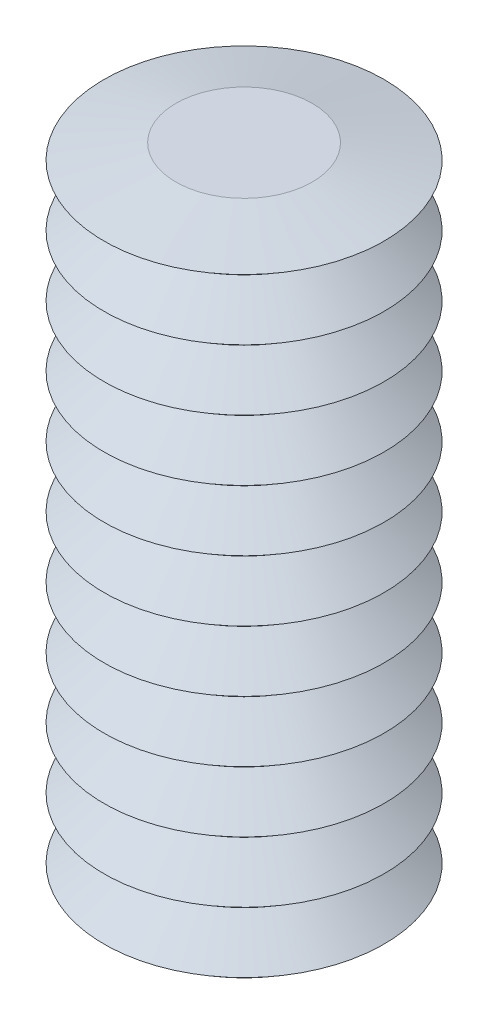
ISO-10303-21;
HEADER;
FILE_DESCRIPTION(('STEP AP214'),'2;1');
FILE_NAME('part.step','',(''),(''),'','','');
FILE_SCHEMA(('AUTOMOTIVE_DESIGN { 1 0 10303 214 1 1 1 1 }'));
ENDSEC;
DATA;
#1=APPLICATION_CONTEXT('core data for automotive mechanical design processes');
#2=APPLICATION_PROTOCOL_DEFINITION('international standard','automotive_design',2000,#1);
#3=PRODUCT_CONTEXT('',#1,'mechanical');
#4=PRODUCT('Part','Part','',(#3));
#5=PRODUCT_RELATED_PRODUCT_CATEGORY('part','',(#4));
#6=PRODUCT_DEFINITION_FORMATION('','',#4);
#7=PRODUCT_DEFINITION_CONTEXT('part definition',#1,'design');
#8=PRODUCT_DEFINITION('design','',#6,#7);
#9=PRODUCT_DEFINITION_SHAPE('','',#8);
#10=(LENGTH_UNIT() NAMED_UNIT(*) SI_UNIT(.MILLI.,.METRE.));
#11=(NAMED_UNIT(*) PLANE_ANGLE_UNIT() SI_UNIT($,.RADIAN.));
#12=(NAMED_UNIT(*) SI_UNIT($,.STERADIAN.) SOLID_ANGLE_UNIT());
#13=UNCERTAINTY_MEASURE_WITH_UNIT(LENGTH_MEASURE(1.E-05),#10,'distance_accuracy_value','');
#14=(GEOMETRIC_REPRESENTATION_CONTEXT(3) GLOBAL_UNCERTAINTY_ASSIGNED_CONTEXT((#13)) GLOBAL_UNIT_ASSIGNED_CONTEXT((#10,
#11,#12)) REPRESENTATION_CONTEXT('',''));
#15=CARTESIAN_POINT('',(0.,0.,0.));
#16=DIRECTION('',(0.,0.,1.));
#17=DIRECTION('',(1.,0.,0.));
#18=AXIS2_PLACEMENT_3D('',#15,#16,#17);
#19=CARTESIAN_POINT('',(0.,0.,0.));
#20=DIRECTION('',(0.,1.,0.));
#21=DIRECTION('',(0.,0.,1.));
#22=AXIS2_PLACEMENT_3D('',#19,#20,#21);
#23=PLANE('',#22);
#24=CARTESIAN_POINT('',(0.,0.,0.));
#25=DIRECTION('',(0.,-1.,0.));
#26=DIRECTION('',(0.,0.,-1.));
#27=AXIS2_PLACEMENT_3D('',#24,#25,#26);
#28=CIRCLE('',#27,2.24);
#29=CARTESIAN_POINT('',(0.,0.,-2.24));
#30=VERTEX_POINT('',#29);
#31=EDGE_CURVE('E10',#30,#30,#28,.T.);
#32=ORIENTED_EDGE('',*,*,#31,.F.);
#33=EDGE_LOOP('',(#32));
#34=FACE_BOUND('',#33,.T.);
#35=ADVANCED_FACE('F31',(#34),#23,.T.);
#36=CARTESIAN_POINT('',(0.,-0.5,0.));
#37=DIRECTION('',(0.,-1.,0.));
#38=DIRECTION('',(0.,0.,-1.));
#39=AXIS2_PLACEMENT_3D('',#36,#37,#38);
#40=CONICAL_SURFACE('',#39,4.6,1.36201914461283);
#41=ORIENTED_EDGE('',*,*,#31,.T.);
#42=EDGE_LOOP('',(#41));
#43=FACE_BOUND('',#42,.T.);
#44=CARTESIAN_POINT('',(0.,-0.5,0.));
#45=DIRECTION('',(0.,-1.,0.));
#46=DIRECTION('',(0.,0.,-1.));
#47=AXIS2_PLACEMENT_3D('',#44,#45,#46);
#48=CIRCLE('',#47,4.6);
#49=CARTESIAN_POINT('',(0.,-0.5,-4.6));
#50=VERTEX_POINT('',#49);
#51=EDGE_CURVE('E37',#50,#50,#48,.T.);
#52=ORIENTED_EDGE('',*,*,#51,.F.);
#53=EDGE_LOOP('',(#52));
#54=FACE_BOUND('',#53,.T.);
#55=ADVANCED_FACE('F127',(#43,#54),#40,.T.);
#56=CARTESIAN_POINT('',(0.,-1.5,0.));
#57=DIRECTION('',(0.,1.,0.));
#58=DIRECTION('',(0.,0.,1.));
#59=AXIS2_PLACEMENT_3D('',#56,#57,#58);
#60=CONICAL_SURFACE('',#59,3.2,0.950546840812075);
#61=ORIENTED_EDGE('',*,*,#51,.T.);
#62=EDGE_LOOP('',(#61));
#63=FACE_BOUND('',#62,.T.);
#64=CARTESIAN_POINT('',(0.,-1.5,0.));
#65=DIRECTION('',(0.,-1.,0.));
#66=DIRECTION('',(0.,0.,-1.));
#67=AXIS2_PLACEMENT_3D('',#64,#65,#66);
#68=CIRCLE('',#67,3.2);
#69=CARTESIAN_POINT('',(0.,-1.5,-3.2));
#70=VERTEX_POINT('',#69);
#71=EDGE_CURVE('E41',#70,#70,#68,.T.);
#72=ORIENTED_EDGE('',*,*,#71,.F.);
#73=EDGE_LOOP('',(#72));
#74=FACE_BOUND('',#73,.T.);
#75=ADVANCED_FACE('F132',(#63,#74),#60,.T.);
#76=CARTESIAN_POINT('',(0.,-2.5,0.));
#77=DIRECTION('',(0.,-1.,0.));
#78=DIRECTION('',(0.,0.,-1.));
#79=AXIS2_PLACEMENT_3D('',#76,#77,#78);
#80=CONICAL_SURFACE('',#79,4.6,0.950546840812076);
#81=ORIENTED_EDGE('',*,*,#71,.T.);
#82=EDGE_LOOP('',(#81));
#83=FACE_BOUND('',#82,.T.);
#84=CARTESIAN_POINT('',(0.,-2.5,0.));
#85=DIRECTION('',(0.,-1.,0.));
#86=DIRECTION('',(0.,0.,-1.));
#87=AXIS2_PLACEMENT_3D('',#84,#85,#86);
#88=CIRCLE('',#87,4.6);
#89=CARTESIAN_POINT('',(0.,-2.5,-4.6));
#90=VERTEX_POINT('',#89);
#91=EDGE_CURVE('E45',#90,#90,#88,.T.);
#92=ORIENTED_EDGE('',*,*,#91,.F.);
#93=EDGE_LOOP('',(#92));
#94=FACE_BOUND('',#93,.T.);
#95=ADVANCED_FACE('F136',(#83,#94),#80,.T.);
#96=CARTESIAN_POINT('',(0.,-3.5,0.));
#97=DIRECTION('',(0.,1.,0.));
#98=DIRECTION('',(0.,0.,1.));
#99=AXIS2_PLACEMENT_3D('',#96,#97,#98);
#100=CONICAL_SURFACE('',#99,3.2,0.950546840812075);
#101=ORIENTED_EDGE('',*,*,#91,.T.);
#102=EDGE_LOOP('',(#101));
#103=FACE_BOUND('',#102,.T.);
#104=CARTESIAN_POINT('',(0.,-3.5,0.));
#105=DIRECTION('',(0.,-1.,0.));
#106=DIRECTION('',(0.,0.,-1.));
#107=AXIS2_PLACEMENT_3D('',#104,#105,#106);
#108=CIRCLE('',#107,3.2);
#109=CARTESIAN_POINT('',(0.,-3.5,-3.2));
#110=VERTEX_POINT('',#109);
#111=EDGE_CURVE('E50',#110,#110,#108,.T.);
#112=ORIENTED_EDGE('',*,*,#111,.F.);
#113=EDGE_LOOP('',(#112));
#114=FACE_BOUND('',#113,.T.);
#115=ADVANCED_FACE('F142',(#103,#114),#100,.T.);
#116=CARTESIAN_POINT('',(0.,-4.5,0.));
#117=DIRECTION('',(0.,-1.,0.));
#118=DIRECTION('',(0.,0.,-1.));
#119=AXIS2_PLACEMENT_3D('',#116,#117,#118);
#120=CONICAL_SURFACE('',#119,4.6,0.950546840812075);
#121=ORIENTED_EDGE('',*,*,#111,.T.);
#122=EDGE_LOOP('',(#121));
#123=FACE_BOUND('',#122,.T.);
#124=CARTESIAN_POINT('',(0.,-4.5,0.));
#125=DIRECTION('',(0.,-1.,0.));
#126=DIRECTION('',(0.,0.,-1.));
#127=AXIS2_PLACEMENT_3D('',#124,#125,#126);
#128=CIRCLE('',#127,4.6);
#129=CARTESIAN_POINT('',(0.,-4.5,-4.6));
#130=VERTEX_POINT('',#129);
#131=EDGE_CURVE('E53',#130,#130,#128,.T.);
#132=ORIENTED_EDGE('',*,*,#131,.F.);
#133=EDGE_LOOP('',(#132));
#134=FACE_BOUND('',#133,.T.);
#135=ADVANCED_FACE('F146',(#123,#134),#120,.T.);
#136=CARTESIAN_POINT('',(0.,-5.5,0.));
#137=DIRECTION('',(0.,1.,0.));
#138=DIRECTION('',(0.,0.,1.));
#139=AXIS2_PLACEMENT_3D('',#136,#137,#138);
#140=CONICAL_SURFACE('',#139,3.2,0.950546840812076);
#141=ORIENTED_EDGE('',*,*,#131,.T.);
#142=EDGE_LOOP('',(#141));
#143=FACE_BOUND('',#142,.T.);
#144=CARTESIAN_POINT('',(0.,-5.5,0.));
#145=DIRECTION('',(0.,-1.,0.));
#146=DIRECTION('',(0.,0.,-1.));
#147=AXIS2_PLACEMENT_3D('',#144,#145,#146);
#148=CIRCLE('',#147,3.2);
#149=CARTESIAN_POINT('',(0.,-5.5,-3.2));
#150=VERTEX_POINT('',#149);
#151=EDGE_CURVE('E56',#150,#150,#148,.T.);
#152=ORIENTED_EDGE('',*,*,#151,.F.);
#153=EDGE_LOOP('',(#152));
#154=FACE_BOUND('',#153,.T.);
#155=ADVANCED_FACE('F150',(#143,#154),#140,.T.);
#156=CARTESIAN_POINT('',(0.,-6.5,0.));
#157=DIRECTION('',(0.,-1.,0.));
#158=DIRECTION('',(0.,0.,-1.));
#159=AXIS2_PLACEMENT_3D('',#156,#157,#158);
#160=CONICAL_SURFACE('',#159,4.6,0.950546840812075);
#161=ORIENTED_EDGE('',*,*,#151,.T.);
#162=EDGE_LOOP('',(#161));
#163=FACE_BOUND('',#162,.T.);
#164=CARTESIAN_POINT('',(0.,-6.5,0.));
#165=DIRECTION('',(0.,-1.,0.));
#166=DIRECTION('',(0.,0.,-1.));
#167=AXIS2_PLACEMENT_3D('',#164,#165,#166);
#168=CIRCLE('',#167,4.6);
#169=CARTESIAN_POINT('',(0.,-6.5,-4.6));
#170=VERTEX_POINT('',#169);
#171=EDGE_CURVE('E59',#170,#170,#168,.T.);
#172=ORIENTED_EDGE('',*,*,#171,.F.);
#173=EDGE_LOOP('',(#172));
#174=FACE_BOUND('',#173,.T.);
#175=ADVANCED_FACE('F154',(#163,#174),#160,.T.);
#176=CARTESIAN_POINT('',(0.,-7.5,0.));
#177=DIRECTION('',(0.,1.,0.));
#178=DIRECTION('',(0.,0.,1.));
#179=AXIS2_PLACEMENT_3D('',#176,#177,#178);
#180=CONICAL_SURFACE('',#179,3.2,0.950546840812075);
#181=ORIENTED_EDGE('',*,*,#171,.T.);
#182=EDGE_LOOP('',(#181));
#183=FACE_BOUND('',#182,.T.);
#184=CARTESIAN_POINT('',(0.,-7.5,0.));
#185=DIRECTION('',(0.,-1.,0.));
#186=DIRECTION('',(0.,0.,-1.));
#187=AXIS2_PLACEMENT_3D('',#184,#185,#186);
#188=CIRCLE('',#187,3.2);
#189=CARTESIAN_POINT('',(0.,-7.5,-3.2));
#190=VERTEX_POINT('',#189);
#191=EDGE_CURVE('E62',#190,#190,#188,.T.);
#192=ORIENTED_EDGE('',*,*,#191,.F.);
#193=EDGE_LOOP('',(#192));
#194=FACE_BOUND('',#193,.T.);
#195=ADVANCED_FACE('F158',(#183,#194),#180,.T.);
#196=CARTESIAN_POINT('',(0.,-8.5,0.));
#197=DIRECTION('',(0.,-1.,0.));
#198=DIRECTION('',(0.,0.,-1.));
#199=AXIS2_PLACEMENT_3D('',#196,#197,#198);
#200=CONICAL_SURFACE('',#199,4.6,0.950546840812075);
#201=ORIENTED_EDGE('',*,*,#191,.T.);
#202=EDGE_LOOP('',(#201));
#203=FACE_BOUND('',#202,.T.);
#204=CARTESIAN_POINT('',(0.,-8.5,0.));
#205=DIRECTION('',(0.,-1.,0.));
#206=DIRECTION('',(0.,0.,-1.));
#207=AXIS2_PLACEMENT_3D('',#204,#205,#206);
#208=CIRCLE('',#207,4.6);
#209=CARTESIAN_POINT('',(0.,-8.5,-4.6));
#210=VERTEX_POINT('',#209);
#211=EDGE_CURVE('E65',#210,#210,#208,.T.);
#212=ORIENTED_EDGE('',*,*,#211,.F.);
#213=EDGE_LOOP('',(#212));
#214=FACE_BOUND('',#213,.T.);
#215=ADVANCED_FACE('F162',(#203,#214),#200,.T.);
#216=CARTESIAN_POINT('',(0.,-9.5,0.));
#217=DIRECTION('',(0.,1.,0.));
#218=DIRECTION('',(0.,0.,1.));
#219=AXIS2_PLACEMENT_3D('',#216,#217,#218);
#220=CONICAL_SURFACE('',#219,3.2,0.950546840812075);
#221=ORIENTED_EDGE('',*,*,#211,.T.);
#222=EDGE_LOOP('',(#221));
#223=FACE_BOUND('',#222,.T.);
#224=CARTESIAN_POINT('',(0.,-9.5,0.));
#225=DIRECTION('',(0.,-1.,0.));
#226=DIRECTION('',(0.,0.,-1.));
#227=AXIS2_PLACEMENT_3D('',#224,#225,#226);
#228=CIRCLE('',#227,3.2);
#229=CARTESIAN_POINT('',(0.,-9.5,-3.2));
#230=VERTEX_POINT('',#229);
#231=EDGE_CURVE('E68',#230,#230,#228,.T.);
#232=ORIENTED_EDGE('',*,*,#231,.F.);
#233=EDGE_LOOP('',(#232));
#234=FACE_BOUND('',#233,.T.);
#235=ADVANCED_FACE('F166',(#223,#234),#220,.T.);
#236=CARTESIAN_POINT('',(0.,-10.5,0.));
#237=DIRECTION('',(0.,-1.,0.));
#238=DIRECTION('',(0.,0.,-1.));
#239=AXIS2_PLACEMENT_3D('',#236,#237,#238);
#240=CONICAL_SURFACE('',#239,4.6,0.950546840812076);
#241=ORIENTED_EDGE('',*,*,#231,.T.);
#242=EDGE_LOOP('',(#241));
#243=FACE_BOUND('',#242,.T.);
#244=CARTESIAN_POINT('',(0.,-10.5,0.));
#245=DIRECTION('',(0.,-1.,0.));
#246=DIRECTION('',(0.,0.,-1.));
#247=AXIS2_PLACEMENT_3D('',#244,#245,#246);
#248=CIRCLE('',#247,4.6);
#249=CARTESIAN_POINT('',(0.,-10.5,-4.6));
#250=VERTEX_POINT('',#249);
#251=EDGE_CURVE('E71',#250,#250,#248,.T.);
#252=ORIENTED_EDGE('',*,*,#251,.F.);
#253=EDGE_LOOP('',(#252));
#254=FACE_BOUND('',#253,.T.);
#255=ADVANCED_FACE('F170',(#243,#254),#240,.T.);
#256=CARTESIAN_POINT('',(0.,-11.5,0.));
#257=DIRECTION('',(0.,1.,0.));
#258=DIRECTION('',(0.,0.,1.));
#259=AXIS2_PLACEMENT_3D('',#256,#257,#258);
#260=CONICAL_SURFACE('',#259,3.2,0.950546840812076);
#261=ORIENTED_EDGE('',*,*,#251,.T.);
#262=EDGE_LOOP('',(#261));
#263=FACE_BOUND('',#262,.T.);
#264=CARTESIAN_POINT('',(0.,-11.5,0.));
#265=DIRECTION('',(0.,-1.,0.));
#266=DIRECTION('',(0.,0.,-1.));
#267=AXIS2_PLACEMENT_3D('',#264,#265,#266);
#268=CIRCLE('',#267,3.2);
#269=CARTESIAN_POINT('',(0.,-11.5,-3.2));
#270=VERTEX_POINT('',#269);
#271=EDGE_CURVE('E74',#270,#270,#268,.T.);
#272=ORIENTED_EDGE('',*,*,#271,.F.);
#273=EDGE_LOOP('',(#272));
#274=FACE_BOUND('',#273,.T.);
#275=ADVANCED_FACE('F174',(#263,#274),#260,.T.);
#276=CARTESIAN_POINT('',(0.,-12.5,0.));
#277=DIRECTION('',(0.,-1.,0.));
#278=DIRECTION('',(0.,0.,-1.));
#279=AXIS2_PLACEMENT_3D('',#276,#277,#278);
#280=CONICAL_SURFACE('',#279,4.6,0.950546840812075);
#281=ORIENTED_EDGE('',*,*,#271,.T.);
#282=EDGE_LOOP('',(#281));
#283=FACE_BOUND('',#282,.T.);
#284=CARTESIAN_POINT('',(0.,-12.5,0.));
#285=DIRECTION('',(0.,-1.,0.));
#286=DIRECTION('',(0.,0.,-1.));
#287=AXIS2_PLACEMENT_3D('',#284,#285,#286);
#288=CIRCLE('',#287,4.6);
#289=CARTESIAN_POINT('',(0.,-12.5,-4.6));
#290=VERTEX_POINT('',#289);
#291=EDGE_CURVE('E77',#290,#290,#288,.T.);
#292=ORIENTED_EDGE('',*,*,#291,.F.);
#293=EDGE_LOOP('',(#292));
#294=FACE_BOUND('',#293,.T.);
#295=ADVANCED_FACE('F178',(#283,#294),#280,.T.);
#296=CARTESIAN_POINT('',(0.,-13.5,0.));
#297=DIRECTION('',(0.,1.,0.));
#298=DIRECTION('',(0.,0.,1.));
#299=AXIS2_PLACEMENT_3D('',#296,#297,#298);
#300=CONICAL_SURFACE('',#299,3.2,0.950546840812076);
#301=ORIENTED_EDGE('',*,*,#291,.T.);
#302=EDGE_LOOP('',(#301));
#303=FACE_BOUND('',#302,.T.);
#304=CARTESIAN_POINT('',(0.,-13.5,0.));
#305=DIRECTION('',(0.,-1.,0.));
#306=DIRECTION('',(0.,0.,-1.));
#307=AXIS2_PLACEMENT_3D('',#304,#305,#306);
#308=CIRCLE('',#307,3.2);
#309=CARTESIAN_POINT('',(0.,-13.5,-3.2));
#310=VERTEX_POINT('',#309);
#311=EDGE_CURVE('E80',#310,#310,#308,.T.);
#312=ORIENTED_EDGE('',*,*,#311,.F.);
#313=EDGE_LOOP('',(#312));
#314=FACE_BOUND('',#313,.T.);
#315=ADVANCED_FACE('F182',(#303,#314),#300,.T.);
#316=CARTESIAN_POINT('',(0.,-14.5,0.));
#317=DIRECTION('',(0.,-1.,0.));
#318=DIRECTION('',(0.,0.,-1.));
#319=AXIS2_PLACEMENT_3D('',#316,#317,#318);
#320=CONICAL_SURFACE('',#319,4.6,0.950546840812075);
#321=ORIENTED_EDGE('',*,*,#311,.T.);
#322=EDGE_LOOP('',(#321));
#323=FACE_BOUND('',#322,.T.);
#324=CARTESIAN_POINT('',(0.,-14.5,0.));
#325=DIRECTION('',(0.,-1.,0.));
#326=DIRECTION('',(0.,0.,-1.));
#327=AXIS2_PLACEMENT_3D('',#324,#325,#326);
#328=CIRCLE('',#327,4.6);
#329=CARTESIAN_POINT('',(0.,-14.5,-4.6));
#330=VERTEX_POINT('',#329);
#331=EDGE_CURVE('E83',#330,#330,#328,.T.);
#332=ORIENTED_EDGE('',*,*,#331,.F.);
#333=EDGE_LOOP('',(#332));
#334=FACE_BOUND('',#333,.T.);
#335=ADVANCED_FACE('F186',(#323,#334),#320,.T.);
#336=CARTESIAN_POINT('',(0.,-15.5,0.));
#337=DIRECTION('',(0.,1.,0.));
#338=DIRECTION('',(0.,0.,1.));
#339=AXIS2_PLACEMENT_3D('',#336,#337,#338);
#340=CONICAL_SURFACE('',#339,3.2,0.950546840812076);
#341=ORIENTED_EDGE('',*,*,#331,.T.);
#342=EDGE_LOOP('',(#341));
#343=FACE_BOUND('',#342,.T.);
#344=CARTESIAN_POINT('',(0.,-15.5,0.));
#345=DIRECTION('',(0.,-1.,0.));
#346=DIRECTION('',(0.,0.,-1.));
#347=AXIS2_PLACEMENT_3D('',#344,#345,#346);
#348=CIRCLE('',#347,3.2);
#349=CARTESIAN_POINT('',(0.,-15.5,-3.2));
#350=VERTEX_POINT('',#349);
#351=EDGE_CURVE('E86',#350,#350,#348,.T.);
#352=ORIENTED_EDGE('',*,*,#351,.F.);
#353=EDGE_LOOP('',(#352));
#354=FACE_BOUND('',#353,.T.);
#355=ADVANCED_FACE('F190',(#343,#354),#340,.T.);
#356=CARTESIAN_POINT('',(0.,-16.5,0.));
#357=DIRECTION('',(0.,-1.,0.));
#358=DIRECTION('',(0.,0.,-1.));
#359=AXIS2_PLACEMENT_3D('',#356,#357,#358);
#360=CONICAL_SURFACE('',#359,4.6,0.950546840812075);
#361=ORIENTED_EDGE('',*,*,#351,.T.);
#362=EDGE_LOOP('',(#361));
#363=FACE_BOUND('',#362,.T.);
#364=CARTESIAN_POINT('',(0.,-16.5,0.));
#365=DIRECTION('',(0.,-1.,0.));
#366=DIRECTION('',(0.,0.,-1.));
#367=AXIS2_PLACEMENT_3D('',#364,#365,#366);
#368=CIRCLE('',#367,4.6);
#369=CARTESIAN_POINT('',(0.,-16.5,-4.6));
#370=VERTEX_POINT('',#369);
#371=EDGE_CURVE('E89',#370,#370,#368,.T.);
#372=ORIENTED_EDGE('',*,*,#371,.F.);
#373=EDGE_LOOP('',(#372));
#374=FACE_BOUND('',#373,.T.);
#375=ADVANCED_FACE('F194',(#363,#374),#360,.T.);
#376=CARTESIAN_POINT('',(0.,-17.5,0.));
#377=DIRECTION('',(0.,1.,0.));
#378=DIRECTION('',(0.,0.,1.));
#379=AXIS2_PLACEMENT_3D('',#376,#377,#378);
#380=CONICAL_SURFACE('',#379,3.2,0.950546840812075);
#381=ORIENTED_EDGE('',*,*,#371,.T.);
#382=EDGE_LOOP('',(#381));
#383=FACE_BOUND('',#382,.T.);
#384=CARTESIAN_POINT('',(0.,-17.5,0.));
#385=DIRECTION('',(0.,-1.,0.));
#386=DIRECTION('',(0.,0.,-1.));
#387=AXIS2_PLACEMENT_3D('',#384,#385,#386);
#388=CIRCLE('',#387,3.2);
#389=CARTESIAN_POINT('',(0.,-17.5,-3.2));
#390=VERTEX_POINT('',#389);
#391=EDGE_CURVE('E92',#390,#390,#388,.T.);
#392=ORIENTED_EDGE('',*,*,#391,.F.);
#393=EDGE_LOOP('',(#392));
#394=FACE_BOUND('',#393,.T.);
#395=ADVANCED_FACE('F198',(#383,#394),#380,.T.);
#396=CARTESIAN_POINT('',(0.,-18.5,0.));
#397=DIRECTION('',(0.,-1.,0.));
#398=DIRECTION('',(0.,0.,-1.));
#399=AXIS2_PLACEMENT_3D('',#396,#397,#398);
#400=CONICAL_SURFACE('',#399,4.6,0.950546840812076);
#401=ORIENTED_EDGE('',*,*,#391,.T.);
#402=EDGE_LOOP('',(#401));
#403=FACE_BOUND('',#402,.T.);
#404=CARTESIAN_POINT('',(0.,-18.5,0.));
#405=DIRECTION('',(0.,-1.,0.));
#406=DIRECTION('',(0.,0.,-1.));
#407=AXIS2_PLACEMENT_3D('',#404,#405,#406);
#408=CIRCLE('',#407,4.6);
#409=CARTESIAN_POINT('',(0.,-18.5,-4.6));
#410=VERTEX_POINT('',#409);
#411=EDGE_CURVE('E95',#410,#410,#408,.T.);
#412=ORIENTED_EDGE('',*,*,#411,.F.);
#413=EDGE_LOOP('',(#412));
#414=FACE_BOUND('',#413,.T.);
#415=ADVANCED_FACE('F202',(#403,#414),#400,.T.);
#416=CARTESIAN_POINT('',(0.,-19.5,0.));
#417=DIRECTION('',(0.,1.,0.));
#418=DIRECTION('',(0.,0.,1.));
#419=AXIS2_PLACEMENT_3D('',#416,#417,#418);
#420=CONICAL_SURFACE('',#419,3.2,0.950546840812075);
#421=ORIENTED_EDGE('',*,*,#411,.T.);
#422=EDGE_LOOP('',(#421));
#423=FACE_BOUND('',#422,.T.);
#424=CARTESIAN_POINT('',(0.,-19.5,0.));
#425=DIRECTION('',(0.,-1.,0.));
#426=DIRECTION('',(0.,0.,-1.));
#427=AXIS2_PLACEMENT_3D('',#424,#425,#426);
#428=CIRCLE('',#427,3.2);
#429=CARTESIAN_POINT('',(0.,-19.5,-3.2));
#430=VERTEX_POINT('',#429);
#431=EDGE_CURVE('E98',#430,#430,#428,.T.);
#432=ORIENTED_EDGE('',*,*,#431,.F.);
#433=EDGE_LOOP('',(#432));
#434=FACE_BOUND('',#433,.T.);
#435=ADVANCED_FACE('F206',(#423,#434),#420,.T.);
#436=CARTESIAN_POINT('',(0.,-20.5,0.));
#437=DIRECTION('',(0.,-1.,0.));
#438=DIRECTION('',(0.,0.,-1.));
#439=AXIS2_PLACEMENT_3D('',#436,#437,#438);
#440=CONICAL_SURFACE('',#439,4.6,0.950546840812075);
#441=ORIENTED_EDGE('',*,*,#431,.T.);
#442=EDGE_LOOP('',(#441));
#443=FACE_BOUND('',#442,.T.);
#444=CARTESIAN_POINT('',(0.,-20.5,0.));
#445=DIRECTION('',(0.,-1.,0.));
#446=DIRECTION('',(0.,0.,-1.));
#447=AXIS2_PLACEMENT_3D('',#444,#445,#446);
#448=CIRCLE('',#447,4.6);
#449=CARTESIAN_POINT('',(0.,-20.5,-4.6));
#450=VERTEX_POINT('',#449);
#451=EDGE_CURVE('E101',#450,#450,#448,.T.);
#452=ORIENTED_EDGE('',*,*,#451,.F.);
#453=EDGE_LOOP('',(#452));
#454=FACE_BOUND('',#453,.T.);
#455=ADVANCED_FACE('F123',(#443,#454),#440,.T.);
#456=CARTESIAN_POINT('',(0.,-21.5,0.));
#457=DIRECTION('',(0.,1.,0.));
#458=DIRECTION('',(0.,0.,1.));
#459=AXIS2_PLACEMENT_3D('',#456,#457,#458);
#460=CONICAL_SURFACE('',#459,3.2,0.950546840812075);
#461=ORIENTED_EDGE('',*,*,#451,.T.);
#462=EDGE_LOOP('',(#461));
#463=FACE_BOUND('',#462,.T.);
#464=CARTESIAN_POINT('',(0.,-21.5,0.));
#465=DIRECTION('',(0.,-1.,0.));
#466=DIRECTION('',(0.,0.,-1.));
#467=AXIS2_PLACEMENT_3D('',#464,#465,#466);
#468=CIRCLE('',#467,3.2);
#469=CARTESIAN_POINT('',(0.,-21.5,-3.2));
#470=VERTEX_POINT('',#469);
#471=EDGE_CURVE('E104',#470,#470,#468,.T.);
#472=ORIENTED_EDGE('',*,*,#471,.F.);
#473=EDGE_LOOP('',(#472));
#474=FACE_BOUND('',#473,.T.);
#475=ADVANCED_FACE('F115',(#463,#474),#460,.T.);
#476=CARTESIAN_POINT('',(0.,-22.,0.));
#477=DIRECTION('',(0.,1.,0.));
#478=DIRECTION('',(0.,0.,1.));
#479=AXIS2_PLACEMENT_3D('',#476,#477,#478);
#480=CONICAL_SURFACE('',#479,2.24,1.09062129719137);
#481=ORIENTED_EDGE('',*,*,#471,.T.);
#482=EDGE_LOOP('',(#481));
#483=FACE_BOUND('',#482,.T.);
#484=CARTESIAN_POINT('',(0.,-22.,0.));
#485=DIRECTION('',(0.,-1.,0.));
#486=DIRECTION('',(0.,0.,-1.));
#487=AXIS2_PLACEMENT_3D('',#484,#485,#486);
#488=CIRCLE('',#487,2.24);
#489=CARTESIAN_POINT('',(0.,-22.,-2.24));
#490=VERTEX_POINT('',#489);
#491=EDGE_CURVE('E107',#490,#490,#488,.T.);
#492=ORIENTED_EDGE('',*,*,#491,.F.);
#493=EDGE_LOOP('',(#492));
#494=FACE_BOUND('',#493,.T.);
#495=ADVANCED_FACE('F113',(#483,#494),#480,.T.);
#496=CARTESIAN_POINT('',(2.24,-22.,0.));
#497=DIRECTION('',(0.,-1.,0.));
#498=DIRECTION('',(0.,0.,-1.));
#499=AXIS2_PLACEMENT_3D('',#496,#497,#498);
#500=PLANE('',#499);
#501=ORIENTED_EDGE('',*,*,#491,.T.);
#502=EDGE_LOOP('',(#501));
#503=FACE_BOUND('',#502,.T.);
#504=ADVANCED_FACE('F111',(#503),#500,.T.);
#505=CLOSED_SHELL('',(#35,#55,#75,#95,#115,#135,#155,#175,#195,#215,#235,#255,#275,#295,#315,
#335,#355,#375,#395,#415,#435,#455,#475,#495,#504));
#506=MANIFOLD_SOLID_BREP('B2',#505);
#507=ADVANCED_BREP_SHAPE_REPRESENTATION('',(#18,#506),#14);
#508=SHAPE_DEFINITION_REPRESENTATION(#9,#507);
ENDSEC;
END-ISO-10303-21;
